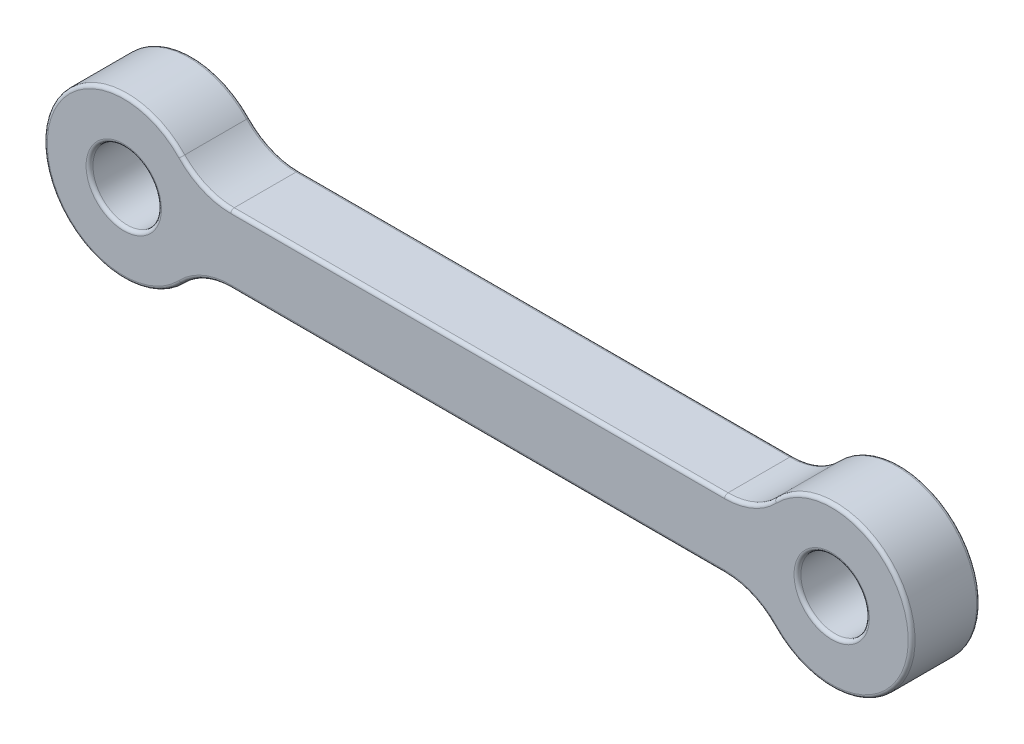
ISO-10303-21;
HEADER;
FILE_DESCRIPTION(('STEP AP214'),'2;1');
FILE_NAME('part.step','',(''),(''),'','','');
FILE_SCHEMA(('AUTOMOTIVE_DESIGN { 1 0 10303 214 1 1 1 1 }'));
ENDSEC;
DATA;
#1=APPLICATION_CONTEXT('core data for automotive mechanical design processes');
#2=APPLICATION_PROTOCOL_DEFINITION('international standard','automotive_design',2000,#1);
#3=PRODUCT_CONTEXT('',#1,'mechanical');
#4=PRODUCT('Part','Part','',(#3));
#5=PRODUCT_RELATED_PRODUCT_CATEGORY('part','',(#4));
#6=PRODUCT_DEFINITION_FORMATION('','',#4);
#7=PRODUCT_DEFINITION_CONTEXT('part definition',#1,'design');
#8=PRODUCT_DEFINITION('design','',#6,#7);
#9=PRODUCT_DEFINITION_SHAPE('','',#8);
#10=(LENGTH_UNIT() NAMED_UNIT(*) SI_UNIT(.MILLI.,.METRE.));
#11=(NAMED_UNIT(*) PLANE_ANGLE_UNIT() SI_UNIT($,.RADIAN.));
#12=(NAMED_UNIT(*) SI_UNIT($,.STERADIAN.) SOLID_ANGLE_UNIT());
#13=UNCERTAINTY_MEASURE_WITH_UNIT(LENGTH_MEASURE(1.E-05),#10,'distance_accuracy_value','');
#14=(GEOMETRIC_REPRESENTATION_CONTEXT(3) GLOBAL_UNCERTAINTY_ASSIGNED_CONTEXT((#13)) GLOBAL_UNIT_ASSIGNED_CONTEXT((#10,
#11,#12)) REPRESENTATION_CONTEXT('',''));
#15=CARTESIAN_POINT('',(0.,0.,0.));
#16=DIRECTION('',(0.,0.,1.));
#17=DIRECTION('',(1.,0.,0.));
#18=AXIS2_PLACEMENT_3D('',#15,#16,#17);
#19=CARTESIAN_POINT('',(31.,0.,1.5));
#20=DIRECTION('',(0.,0.,1.));
#21=DIRECTION('',(1.,0.,0.));
#22=AXIS2_PLACEMENT_3D('',#19,#20,#21);
#23=PLANE('',#22);
#24=CARTESIAN_POINT('',(31.,0.,1.5));
#25=DIRECTION('',(0.,0.,1.));
#26=DIRECTION('',(1.,0.,0.));
#27=AXIS2_PLACEMENT_3D('',#24,#25,#26);
#28=CIRCLE('',#27,1.65);
#29=CARTESIAN_POINT('',(32.65,0.,1.5));
#30=VERTEX_POINT('',#29);
#31=EDGE_CURVE('E177',#30,#30,#28,.F.);
#32=ORIENTED_EDGE('',*,*,#31,.T.);
#33=EDGE_LOOP('',(#32));
#34=FACE_BOUND('',#33,.T.);
#35=CARTESIAN_POINT('',(0.,0.,1.5));
#36=DIRECTION('',(0.,0.,1.));
#37=DIRECTION('',(1.,0.,0.));
#38=AXIS2_PLACEMENT_3D('',#35,#36,#37);
#39=CIRCLE('',#38,3.35);
#40=CARTESIAN_POINT('',(2.41736809296362,2.31923079988203,1.5));
#41=VERTEX_POINT('',#40);
#42=CARTESIAN_POINT('',(2.41736815177746,-2.31923073857951,1.5));
#43=VERTEX_POINT('',#42);
#44=EDGE_CURVE('E175',#41,#43,#39,.T.);
#45=ORIENTED_EDGE('',*,*,#44,.T.);
#46=CARTESIAN_POINT('',(4.69041581688163,-4.4999999405274,1.5));
#47=DIRECTION('',(0.,0.,1.));
#48=DIRECTION('',(1.,0.,0.));
#49=AXIS2_PLACEMENT_3D('',#46,#47,#48);
#50=CIRCLE('',#49,3.15);
#51=CARTESIAN_POINT('',(4.69041581688163,-1.3499999405274,1.5));
#52=VERTEX_POINT('',#51);
#53=EDGE_CURVE('E156',#43,#52,#50,.F.);
#54=ORIENTED_EDGE('',*,*,#53,.T.);
#55=DIRECTION('',(1.,0.,0.));
#56=VECTOR('',#55,1.);
#57=CARTESIAN_POINT('',(26.3095841831184,-1.3499999405274,1.5));
#58=LINE('',#57,#56);
#59=CARTESIAN_POINT('',(26.3095841831184,-1.3499999405274,1.5));
#60=VERTEX_POINT('',#59);
#61=EDGE_CURVE('E164',#52,#60,#58,.T.);
#62=ORIENTED_EDGE('',*,*,#61,.T.);
#63=CARTESIAN_POINT('',(26.3095841831184,-4.4999999405274,1.5));
#64=DIRECTION('',(0.,0.,1.));
#65=DIRECTION('',(1.,0.,0.));
#66=AXIS2_PLACEMENT_3D('',#63,#64,#65);
#67=CIRCLE('',#66,3.15);
#68=CARTESIAN_POINT('',(28.5826318482225,-2.31923073857951,1.5));
#69=VERTEX_POINT('',#68);
#70=EDGE_CURVE('E170',#60,#69,#67,.F.);
#71=ORIENTED_EDGE('',*,*,#70,.T.);
#72=CARTESIAN_POINT('',(31.,0.,1.5));
#73=DIRECTION('',(0.,0.,1.));
#74=DIRECTION('',(1.,0.,0.));
#75=AXIS2_PLACEMENT_3D('',#72,#73,#74);
#76=CIRCLE('',#75,3.35);
#77=CARTESIAN_POINT('',(28.5826319070364,2.31923079988203,1.5));
#78=VERTEX_POINT('',#77);
#79=EDGE_CURVE('E327',#69,#78,#76,.T.);
#80=ORIENTED_EDGE('',*,*,#79,.T.);
#81=CARTESIAN_POINT('',(26.3095842972348,4.5000000594726,1.5));
#82=DIRECTION('',(0.,0.,1.));
#83=DIRECTION('',(1.,0.,0.));
#84=AXIS2_PLACEMENT_3D('',#81,#82,#83);
#85=CIRCLE('',#84,3.15);
#86=CARTESIAN_POINT('',(26.3095842972348,1.3500000594726,1.5));
#87=VERTEX_POINT('',#86);
#88=EDGE_CURVE('E329',#78,#87,#85,.F.);
#89=ORIENTED_EDGE('',*,*,#88,.T.);
#90=DIRECTION('',(-1.,0.,0.));
#91=VECTOR('',#90,1.);
#92=CARTESIAN_POINT('',(4.69041570276522,1.3500000594726,1.5));
#93=LINE('',#92,#91);
#94=CARTESIAN_POINT('',(4.69041570276522,1.3500000594726,1.5));
#95=VERTEX_POINT('',#94);
#96=EDGE_CURVE('E331',#87,#95,#93,.T.);
#97=ORIENTED_EDGE('',*,*,#96,.T.);
#98=CARTESIAN_POINT('',(4.69041570276522,4.5000000594726,1.5));
#99=DIRECTION('',(0.,0.,1.));
#100=DIRECTION('',(1.,0.,0.));
#101=AXIS2_PLACEMENT_3D('',#98,#99,#100);
#102=CIRCLE('',#101,3.15);
#103=EDGE_CURVE('E182',#95,#41,#102,.F.);
#104=ORIENTED_EDGE('',*,*,#103,.T.);
#105=EDGE_LOOP('',(#45,#54,#62,#71,#80,#89,#97,#104));
#106=FACE_BOUND('',#105,.T.);
#107=CARTESIAN_POINT('',(0.,0.,1.5));
#108=DIRECTION('',(0.,0.,1.));
#109=DIRECTION('',(1.,0.,0.));
#110=AXIS2_PLACEMENT_3D('',#107,#108,#109);
#111=CIRCLE('',#110,1.65);
#112=CARTESIAN_POINT('',(1.65,0.,1.5));
#113=VERTEX_POINT('',#112);
#114=EDGE_CURVE('E171',#113,#113,#111,.F.);
#115=ORIENTED_EDGE('',*,*,#114,.T.);
#116=EDGE_LOOP('',(#115));
#117=FACE_BOUND('',#116,.T.);
#118=ADVANCED_FACE('F36',(#34,#106,#117),#23,.T.);
#119=CARTESIAN_POINT('',(31.,0.,-1.5));
#120=DIRECTION('',(0.,0.,1.));
#121=DIRECTION('',(1.,0.,0.));
#122=AXIS2_PLACEMENT_3D('',#119,#120,#121);
#123=PLANE('',#122);
#124=CARTESIAN_POINT('',(31.,0.,-1.5));
#125=DIRECTION('',(0.,0.,1.));
#126=DIRECTION('',(1.,0.,0.));
#127=AXIS2_PLACEMENT_3D('',#124,#125,#126);
#128=CIRCLE('',#127,1.65);
#129=CARTESIAN_POINT('',(32.65,0.,-1.5));
#130=VERTEX_POINT('',#129);
#131=EDGE_CURVE('E11',#130,#130,#128,.T.);
#132=ORIENTED_EDGE('',*,*,#131,.T.);
#133=EDGE_LOOP('',(#132));
#134=FACE_BOUND('',#133,.T.);
#135=CARTESIAN_POINT('',(0.,0.,-1.5));
#136=DIRECTION('',(0.,0.,1.));
#137=DIRECTION('',(1.,0.,0.));
#138=AXIS2_PLACEMENT_3D('',#135,#136,#137);
#139=CIRCLE('',#138,1.65);
#140=CARTESIAN_POINT('',(1.65,0.,-1.5));
#141=VERTEX_POINT('',#140);
#142=EDGE_CURVE('E45',#141,#141,#139,.T.);
#143=ORIENTED_EDGE('',*,*,#142,.T.);
#144=EDGE_LOOP('',(#143));
#145=FACE_BOUND('',#144,.T.);
#146=DIRECTION('',(-1.,0.,0.));
#147=VECTOR('',#146,1.);
#148=CARTESIAN_POINT('',(31.,1.3500000594726,-1.5));
#149=LINE('',#148,#147);
#150=CARTESIAN_POINT('',(4.69041570276522,1.3500000594726,-1.5));
#151=VERTEX_POINT('',#150);
#152=CARTESIAN_POINT('',(26.3095842972348,1.3500000594726,-1.5));
#153=VERTEX_POINT('',#152);
#154=EDGE_CURVE('E53',#151,#153,#149,.F.);
#155=ORIENTED_EDGE('',*,*,#154,.T.);
#156=CARTESIAN_POINT('',(26.3095842972348,4.5000000594726,-1.5));
#157=DIRECTION('',(0.,0.,1.));
#158=DIRECTION('',(1.,0.,0.));
#159=AXIS2_PLACEMENT_3D('',#156,#157,#158);
#160=CIRCLE('',#159,3.15);
#161=CARTESIAN_POINT('',(28.5826319070364,2.31923079988203,-1.5));
#162=VERTEX_POINT('',#161);
#163=EDGE_CURVE('E235',#153,#162,#160,.T.);
#164=ORIENTED_EDGE('',*,*,#163,.T.);
#165=CARTESIAN_POINT('',(31.,0.,-1.5));
#166=DIRECTION('',(0.,0.,1.));
#167=DIRECTION('',(1.,0.,0.));
#168=AXIS2_PLACEMENT_3D('',#165,#166,#167);
#169=CIRCLE('',#168,3.35);
#170=CARTESIAN_POINT('',(28.5826318482225,-2.31923073857951,-1.5));
#171=VERTEX_POINT('',#170);
#172=EDGE_CURVE('E223',#162,#171,#169,.F.);
#173=ORIENTED_EDGE('',*,*,#172,.T.);
#174=CARTESIAN_POINT('',(26.3095841831184,-4.4999999405274,-1.5));
#175=DIRECTION('',(0.,0.,1.));
#176=DIRECTION('',(1.,0.,0.));
#177=AXIS2_PLACEMENT_3D('',#174,#175,#176);
#178=CIRCLE('',#177,3.15);
#179=CARTESIAN_POINT('',(26.3095841831184,-1.3499999405274,-1.5));
#180=VERTEX_POINT('',#179);
#181=EDGE_CURVE('E225',#171,#180,#178,.T.);
#182=ORIENTED_EDGE('',*,*,#181,.T.);
#183=DIRECTION('',(1.,0.,0.));
#184=VECTOR('',#183,1.);
#185=CARTESIAN_POINT('',(31.,-1.3499999405274,-1.5));
#186=LINE('',#185,#184);
#187=CARTESIAN_POINT('',(4.69041581688163,-1.3499999405274,-1.5));
#188=VERTEX_POINT('',#187);
#189=EDGE_CURVE('E227',#180,#188,#186,.F.);
#190=ORIENTED_EDGE('',*,*,#189,.T.);
#191=CARTESIAN_POINT('',(4.69041581688163,-4.4999999405274,-1.5));
#192=DIRECTION('',(0.,0.,1.));
#193=DIRECTION('',(1.,0.,0.));
#194=AXIS2_PLACEMENT_3D('',#191,#192,#193);
#195=CIRCLE('',#194,3.15);
#196=CARTESIAN_POINT('',(2.41736815177746,-2.31923073857951,-1.5));
#197=VERTEX_POINT('',#196);
#198=EDGE_CURVE('E229',#188,#197,#195,.T.);
#199=ORIENTED_EDGE('',*,*,#198,.T.);
#200=CARTESIAN_POINT('',(0.,0.,-1.5));
#201=DIRECTION('',(0.,0.,1.));
#202=DIRECTION('',(1.,0.,0.));
#203=AXIS2_PLACEMENT_3D('',#200,#201,#202);
#204=CIRCLE('',#203,3.35);
#205=CARTESIAN_POINT('',(2.41736809296362,2.31923079988203,-1.5));
#206=VERTEX_POINT('',#205);
#207=EDGE_CURVE('E231',#197,#206,#204,.F.);
#208=ORIENTED_EDGE('',*,*,#207,.T.);
#209=CARTESIAN_POINT('',(4.69041570276522,4.5000000594726,-1.5));
#210=DIRECTION('',(0.,0.,1.));
#211=DIRECTION('',(1.,0.,0.));
#212=AXIS2_PLACEMENT_3D('',#209,#210,#211);
#213=CIRCLE('',#212,3.15);
#214=EDGE_CURVE('E58',#206,#151,#213,.T.);
#215=ORIENTED_EDGE('',*,*,#214,.T.);
#216=EDGE_LOOP('',(#155,#164,#173,#182,#190,#199,#208,#215));
#217=FACE_BOUND('',#216,.T.);
#218=ADVANCED_FACE('F360',(#134,#145,#217),#123,.F.);
#219=CARTESIAN_POINT('',(31.,0.,1.5));
#220=DIRECTION('',(0.,0.,-1.));
#221=DIRECTION('',(-1.,0.,0.));
#222=AXIS2_PLACEMENT_3D('',#219,#220,#221);
#223=CYLINDRICAL_SURFACE('',#222,3.5);
#224=DIRECTION('',(0.,0.,-1.));
#225=VECTOR('',#224,1.);
#226=CARTESIAN_POINT('',(28.4743915446649,2.42307695510063,1.5));
#227=LINE('',#226,#225);
#228=CARTESIAN_POINT('',(28.4743915446649,2.42307695510063,-1.35));
#229=VERTEX_POINT('',#228);
#230=CARTESIAN_POINT('',(28.4743915446649,2.42307695510063,1.35));
#231=VERTEX_POINT('',#230);
#232=EDGE_CURVE('E256',#229,#231,#227,.F.);
#233=ORIENTED_EDGE('',*,*,#232,.T.);
#234=CARTESIAN_POINT('',(31.,0.,1.35));
#235=DIRECTION('',(0.,0.,1.));
#236=DIRECTION('',(1.,0.,0.));
#237=AXIS2_PLACEMENT_3D('',#234,#235,#236);
#238=CIRCLE('',#237,3.5);
#239=CARTESIAN_POINT('',(28.4743914832176,-2.42307689105321,1.35));
#240=VERTEX_POINT('',#239);
#241=EDGE_CURVE('E207',#231,#240,#238,.F.);
#242=ORIENTED_EDGE('',*,*,#241,.T.);
#243=DIRECTION('',(0.,0.,-1.));
#244=VECTOR('',#243,1.);
#245=CARTESIAN_POINT('',(28.4743914832176,-2.42307689105321,1.5));
#246=LINE('',#245,#244);
#247=CARTESIAN_POINT('',(28.4743914832176,-2.42307689105321,-1.35));
#248=VERTEX_POINT('',#247);
#249=EDGE_CURVE('E301',#240,#248,#246,.T.);
#250=ORIENTED_EDGE('',*,*,#249,.T.);
#251=CARTESIAN_POINT('',(31.,0.,-1.35));
#252=DIRECTION('',(0.,0.,1.));
#253=DIRECTION('',(1.,0.,0.));
#254=AXIS2_PLACEMENT_3D('',#251,#252,#253);
#255=CIRCLE('',#254,3.5);
#256=EDGE_CURVE('E205',#248,#229,#255,.T.);
#257=ORIENTED_EDGE('',*,*,#256,.T.);
#258=EDGE_LOOP('',(#233,#242,#250,#257));
#259=FACE_BOUND('',#258,.T.);
#260=ADVANCED_FACE('F373',(#259),#223,.T.);
#261=CARTESIAN_POINT('',(27.837722368042,1.5000000594726,1.5));
#262=DIRECTION('',(0.,-1.,0.));
#263=DIRECTION('',(1.,0.,0.));
#264=AXIS2_PLACEMENT_3D('',#261,#262,#263);
#265=PLANE('',#264);
#266=DIRECTION('',(0.,0.,1.));
#267=VECTOR('',#266,1.);
#268=CARTESIAN_POINT('',(4.69041570276522,1.5000000594726,1.5));
#269=LINE('',#268,#267);
#270=CARTESIAN_POINT('',(4.69041570276522,1.5000000594726,-1.35));
#271=VERTEX_POINT('',#270);
#272=CARTESIAN_POINT('',(4.69041570276522,1.5000000594726,1.35));
#273=VERTEX_POINT('',#272);
#274=EDGE_CURVE('E303',#271,#273,#269,.T.);
#275=ORIENTED_EDGE('',*,*,#274,.T.);
#276=DIRECTION('',(-1.,0.,0.));
#277=VECTOR('',#276,1.);
#278=CARTESIAN_POINT('',(26.3095842972348,1.5000000594726,1.35));
#279=LINE('',#278,#277);
#280=CARTESIAN_POINT('',(26.3095842972348,1.5000000594726,1.35));
#281=VERTEX_POINT('',#280);
#282=EDGE_CURVE('E198',#273,#281,#279,.F.);
#283=ORIENTED_EDGE('',*,*,#282,.T.);
#284=DIRECTION('',(0.,0.,1.));
#285=VECTOR('',#284,1.);
#286=CARTESIAN_POINT('',(26.3095842972348,1.5000000594726,-1.5));
#287=LINE('',#286,#285);
#288=CARTESIAN_POINT('',(26.3095842972348,1.5000000594726,-1.35));
#289=VERTEX_POINT('',#288);
#290=EDGE_CURVE('E311',#281,#289,#287,.F.);
#291=ORIENTED_EDGE('',*,*,#290,.T.);
#292=DIRECTION('',(-1.,0.,0.));
#293=VECTOR('',#292,1.);
#294=CARTESIAN_POINT('',(27.837722368042,1.5000000594726,-1.35));
#295=LINE('',#294,#293);
#296=EDGE_CURVE('E196',#289,#271,#295,.T.);
#297=ORIENTED_EDGE('',*,*,#296,.T.);
#298=EDGE_LOOP('',(#275,#283,#291,#297));
#299=FACE_BOUND('',#298,.T.);
#300=ADVANCED_FACE('F389',(#299),#265,.F.);
#301=CARTESIAN_POINT('',(0.,0.,1.5));
#302=DIRECTION('',(0.,0.,-1.));
#303=DIRECTION('',(-1.,0.,0.));
#304=AXIS2_PLACEMENT_3D('',#301,#302,#303);
#305=CYLINDRICAL_SURFACE('',#304,3.5);
#306=DIRECTION('',(0.,0.,-1.));
#307=VECTOR('',#306,1.);
#308=CARTESIAN_POINT('',(2.52560851678242,-2.42307689105321,1.5));
#309=LINE('',#308,#307);
#310=CARTESIAN_POINT('',(2.52560851678242,-2.42307689105321,-1.35));
#311=VERTEX_POINT('',#310);
#312=CARTESIAN_POINT('',(2.52560851678242,-2.42307689105321,1.35));
#313=VERTEX_POINT('',#312);
#314=EDGE_CURVE('E295',#311,#313,#309,.F.);
#315=ORIENTED_EDGE('',*,*,#314,.T.);
#316=CARTESIAN_POINT('',(0.,0.,1.35));
#317=DIRECTION('',(0.,0.,1.));
#318=DIRECTION('',(1.,0.,0.));
#319=AXIS2_PLACEMENT_3D('',#316,#317,#318);
#320=CIRCLE('',#319,3.5);
#321=CARTESIAN_POINT('',(2.52560845533512,2.42307695510063,1.35));
#322=VERTEX_POINT('',#321);
#323=EDGE_CURVE('E190',#313,#322,#320,.F.);
#324=ORIENTED_EDGE('',*,*,#323,.T.);
#325=DIRECTION('',(0.,0.,-1.));
#326=VECTOR('',#325,1.);
#327=CARTESIAN_POINT('',(2.52560845533512,2.42307695510063,1.5));
#328=LINE('',#327,#326);
#329=CARTESIAN_POINT('',(2.52560845533512,2.42307695510063,-1.35));
#330=VERTEX_POINT('',#329);
#331=EDGE_CURVE('E314',#322,#330,#328,.T.);
#332=ORIENTED_EDGE('',*,*,#331,.T.);
#333=CARTESIAN_POINT('',(0.,0.,-1.35));
#334=DIRECTION('',(0.,0.,1.));
#335=DIRECTION('',(1.,0.,0.));
#336=AXIS2_PLACEMENT_3D('',#333,#334,#335);
#337=CIRCLE('',#336,3.5);
#338=EDGE_CURVE('E188',#330,#311,#337,.T.);
#339=ORIENTED_EDGE('',*,*,#338,.T.);
#340=EDGE_LOOP('',(#315,#324,#332,#339));
#341=FACE_BOUND('',#340,.T.);
#342=ADVANCED_FACE('F344',(#341),#305,.T.);
#343=CARTESIAN_POINT('',(27.8377223116213,-1.4999999405274,1.5));
#344=DIRECTION('',(0.,1.,0.));
#345=DIRECTION('',(-1.,0.,0.));
#346=AXIS2_PLACEMENT_3D('',#343,#344,#345);
#347=PLANE('',#346);
#348=DIRECTION('',(0.,0.,1.));
#349=VECTOR('',#348,1.);
#350=CARTESIAN_POINT('',(26.3095841831184,-1.4999999405274,1.5));
#351=LINE('',#350,#349);
#352=CARTESIAN_POINT('',(26.3095841831184,-1.4999999405274,-1.35));
#353=VERTEX_POINT('',#352);
#354=CARTESIAN_POINT('',(26.3095841831184,-1.4999999405274,1.35));
#355=VERTEX_POINT('',#354);
#356=EDGE_CURVE('E300',#353,#355,#351,.T.);
#357=ORIENTED_EDGE('',*,*,#356,.T.);
#358=DIRECTION('',(1.,0.,0.));
#359=VECTOR('',#358,1.);
#360=CARTESIAN_POINT('',(4.69041581688164,-1.4999999405274,1.35));
#361=LINE('',#360,#359);
#362=CARTESIAN_POINT('',(4.69041581688163,-1.4999999405274,1.35));
#363=VERTEX_POINT('',#362);
#364=EDGE_CURVE('E215',#355,#363,#361,.F.);
#365=ORIENTED_EDGE('',*,*,#364,.T.);
#366=DIRECTION('',(0.,0.,1.));
#367=VECTOR('',#366,1.);
#368=CARTESIAN_POINT('',(4.69041581688163,-1.4999999405274,-1.5));
#369=LINE('',#368,#367);
#370=CARTESIAN_POINT('',(4.69041581688163,-1.4999999405274,-1.35));
#371=VERTEX_POINT('',#370);
#372=EDGE_CURVE('E293',#363,#371,#369,.F.);
#373=ORIENTED_EDGE('',*,*,#372,.T.);
#374=DIRECTION('',(1.,0.,0.));
#375=VECTOR('',#374,1.);
#376=CARTESIAN_POINT('',(27.8377223116213,-1.4999999405274,-1.35));
#377=LINE('',#376,#375);
#378=EDGE_CURVE('E213',#371,#353,#377,.T.);
#379=ORIENTED_EDGE('',*,*,#378,.T.);
#380=EDGE_LOOP('',(#357,#365,#373,#379));
#381=FACE_BOUND('',#380,.T.);
#382=ADVANCED_FACE('F298',(#381),#347,.F.);
#383=CARTESIAN_POINT('',(0.,0.,1.5));
#384=DIRECTION('',(0.,0.,-1.));
#385=DIRECTION('',(-1.,0.,0.));
#386=AXIS2_PLACEMENT_3D('',#383,#384,#385);
#387=CYLINDRICAL_SURFACE('',#386,1.5);
#388=CARTESIAN_POINT('',(0.,0.,1.35));
#389=DIRECTION('',(0.,0.,1.));
#390=DIRECTION('',(1.,0.,0.));
#391=AXIS2_PLACEMENT_3D('',#388,#389,#390);
#392=CIRCLE('',#391,1.5);
#393=CARTESIAN_POINT('',(1.5,0.,1.35));
#394=VERTEX_POINT('',#393);
#395=EDGE_CURVE('E220',#394,#394,#392,.T.);
#396=ORIENTED_EDGE('',*,*,#395,.T.);
#397=EDGE_LOOP('',(#396));
#398=FACE_BOUND('',#397,.T.);
#399=CARTESIAN_POINT('',(0.,0.,-1.35));
#400=DIRECTION('',(0.,0.,1.));
#401=DIRECTION('',(1.,0.,0.));
#402=AXIS2_PLACEMENT_3D('',#399,#400,#401);
#403=CIRCLE('',#402,1.5);
#404=CARTESIAN_POINT('',(1.5,0.,-1.35));
#405=VERTEX_POINT('',#404);
#406=EDGE_CURVE('E217',#405,#405,#403,.F.);
#407=ORIENTED_EDGE('',*,*,#406,.T.);
#408=EDGE_LOOP('',(#407));
#409=FACE_BOUND('',#408,.T.);
#410=ADVANCED_FACE('F407',(#398,#409),#387,.F.);
#411=CARTESIAN_POINT('',(31.,0.,1.5));
#412=DIRECTION('',(0.,0.,-1.));
#413=DIRECTION('',(-1.,0.,0.));
#414=AXIS2_PLACEMENT_3D('',#411,#412,#413);
#415=CYLINDRICAL_SURFACE('',#414,1.5);
#416=CARTESIAN_POINT('',(31.,0.,1.35));
#417=DIRECTION('',(0.,0.,1.));
#418=DIRECTION('',(1.,0.,0.));
#419=AXIS2_PLACEMENT_3D('',#416,#417,#418);
#420=CIRCLE('',#419,1.5);
#421=CARTESIAN_POINT('',(32.5,0.,1.35));
#422=VERTEX_POINT('',#421);
#423=EDGE_CURVE('E321',#422,#422,#420,.T.);
#424=ORIENTED_EDGE('',*,*,#423,.T.);
#425=EDGE_LOOP('',(#424));
#426=FACE_BOUND('',#425,.T.);
#427=CARTESIAN_POINT('',(31.,0.,-1.35));
#428=DIRECTION('',(0.,0.,1.));
#429=DIRECTION('',(1.,0.,0.));
#430=AXIS2_PLACEMENT_3D('',#427,#428,#429);
#431=CIRCLE('',#430,1.5);
#432=CARTESIAN_POINT('',(32.5,0.,-1.35));
#433=VERTEX_POINT('',#432);
#434=EDGE_CURVE('E318',#433,#433,#431,.F.);
#435=ORIENTED_EDGE('',*,*,#434,.T.);
#436=EDGE_LOOP('',(#435));
#437=FACE_BOUND('',#436,.T.);
#438=ADVANCED_FACE('F414',(#426,#437),#415,.F.);
#439=CARTESIAN_POINT('',(26.3095841831184,-4.4999999405274,1.5));
#440=DIRECTION('',(0.,0.,-1.));
#441=DIRECTION('',(-1.,0.,0.));
#442=AXIS2_PLACEMENT_3D('',#439,#440,#441);
#443=CYLINDRICAL_SURFACE('',#442,3.);
#444=ORIENTED_EDGE('',*,*,#249,.F.);
#445=CARTESIAN_POINT('',(26.3095841831184,-4.4999999405274,1.35));
#446=DIRECTION('',(0.,0.,1.));
#447=DIRECTION('',(1.,0.,0.));
#448=AXIS2_PLACEMENT_3D('',#445,#446,#447);
#449=CIRCLE('',#448,3.);
#450=EDGE_CURVE('E211',#240,#355,#449,.T.);
#451=ORIENTED_EDGE('',*,*,#450,.T.);
#452=ORIENTED_EDGE('',*,*,#356,.F.);
#453=CARTESIAN_POINT('',(26.3095841831184,-4.4999999405274,-1.35));
#454=DIRECTION('',(0.,0.,1.));
#455=DIRECTION('',(1.,0.,0.));
#456=AXIS2_PLACEMENT_3D('',#453,#454,#455);
#457=CIRCLE('',#456,3.);
#458=EDGE_CURVE('E209',#353,#248,#457,.F.);
#459=ORIENTED_EDGE('',*,*,#458,.T.);
#460=EDGE_LOOP('',(#444,#451,#452,#459));
#461=FACE_BOUND('',#460,.T.);
#462=ADVANCED_FACE('F419',(#461),#443,.F.);
#463=CARTESIAN_POINT('',(26.3095842972348,4.5000000594726,1.5));
#464=DIRECTION('',(0.,0.,-1.));
#465=DIRECTION('',(-1.,0.,0.));
#466=AXIS2_PLACEMENT_3D('',#463,#464,#465);
#467=CYLINDRICAL_SURFACE('',#466,3.);
#468=ORIENTED_EDGE('',*,*,#290,.F.);
#469=CARTESIAN_POINT('',(26.3095842972348,4.5000000594726,1.35));
#470=DIRECTION('',(0.,0.,1.));
#471=DIRECTION('',(1.,0.,0.));
#472=AXIS2_PLACEMENT_3D('',#469,#470,#471);
#473=CIRCLE('',#472,3.);
#474=EDGE_CURVE('E203',#281,#231,#473,.T.);
#475=ORIENTED_EDGE('',*,*,#474,.T.);
#476=ORIENTED_EDGE('',*,*,#232,.F.);
#477=CARTESIAN_POINT('',(26.3095842972348,4.5000000594726,-1.35));
#478=DIRECTION('',(0.,0.,1.));
#479=DIRECTION('',(1.,0.,0.));
#480=AXIS2_PLACEMENT_3D('',#477,#478,#479);
#481=CIRCLE('',#480,3.);
#482=EDGE_CURVE('E200',#229,#289,#481,.F.);
#483=ORIENTED_EDGE('',*,*,#482,.T.);
#484=EDGE_LOOP('',(#468,#475,#476,#483));
#485=FACE_BOUND('',#484,.T.);
#486=ADVANCED_FACE('F378',(#485),#467,.F.);
#487=CARTESIAN_POINT('',(4.69041581688163,-4.4999999405274,1.5));
#488=DIRECTION('',(0.,0.,-1.));
#489=DIRECTION('',(-1.,0.,0.));
#490=AXIS2_PLACEMENT_3D('',#487,#488,#489);
#491=CYLINDRICAL_SURFACE('',#490,3.);
#492=ORIENTED_EDGE('',*,*,#372,.F.);
#493=CARTESIAN_POINT('',(4.69041581688163,-4.4999999405274,1.35));
#494=DIRECTION('',(0.,0.,1.));
#495=DIRECTION('',(1.,0.,0.));
#496=AXIS2_PLACEMENT_3D('',#493,#494,#495);
#497=CIRCLE('',#496,3.);
#498=EDGE_CURVE('E158',#363,#313,#497,.T.);
#499=ORIENTED_EDGE('',*,*,#498,.T.);
#500=ORIENTED_EDGE('',*,*,#314,.F.);
#501=CARTESIAN_POINT('',(4.69041581688163,-4.4999999405274,-1.35));
#502=DIRECTION('',(0.,0.,1.));
#503=DIRECTION('',(1.,0.,0.));
#504=AXIS2_PLACEMENT_3D('',#501,#502,#503);
#505=CIRCLE('',#504,3.);
#506=EDGE_CURVE('E180',#311,#371,#505,.F.);
#507=ORIENTED_EDGE('',*,*,#506,.T.);
#508=EDGE_LOOP('',(#492,#499,#500,#507));
#509=FACE_BOUND('',#508,.T.);
#510=ADVANCED_FACE('F292',(#509),#491,.F.);
#511=CARTESIAN_POINT('',(4.69041570276522,4.5000000594726,1.5));
#512=DIRECTION('',(0.,0.,-1.));
#513=DIRECTION('',(-1.,0.,0.));
#514=AXIS2_PLACEMENT_3D('',#511,#512,#513);
#515=CYLINDRICAL_SURFACE('',#514,3.);
#516=ORIENTED_EDGE('',*,*,#331,.F.);
#517=CARTESIAN_POINT('',(4.69041570276522,4.5000000594726,1.35));
#518=DIRECTION('',(0.,0.,1.));
#519=DIRECTION('',(1.,0.,0.));
#520=AXIS2_PLACEMENT_3D('',#517,#518,#519);
#521=CIRCLE('',#520,3.);
#522=EDGE_CURVE('E194',#322,#273,#521,.T.);
#523=ORIENTED_EDGE('',*,*,#522,.T.);
#524=ORIENTED_EDGE('',*,*,#274,.F.);
#525=CARTESIAN_POINT('',(4.69041570276522,4.5000000594726,-1.35));
#526=DIRECTION('',(0.,0.,1.));
#527=DIRECTION('',(1.,0.,0.));
#528=AXIS2_PLACEMENT_3D('',#525,#526,#527);
#529=CIRCLE('',#528,3.);
#530=EDGE_CURVE('E192',#271,#330,#529,.F.);
#531=ORIENTED_EDGE('',*,*,#530,.T.);
#532=EDGE_LOOP('',(#516,#523,#524,#531));
#533=FACE_BOUND('',#532,.T.);
#534=ADVANCED_FACE('F346',(#533),#515,.F.);
#535=CARTESIAN_POINT('',(31.,0.,1.35));
#536=DIRECTION('',(0.,0.,1.));
#537=DIRECTION('',(1.,0.,0.));
#538=AXIS2_PLACEMENT_3D('',#535,#536,#537);
#539=TOROIDAL_SURFACE('',#538,1.65,0.15);
#540=ORIENTED_EDGE('',*,*,#31,.F.);
#541=EDGE_LOOP('',(#540));
#542=FACE_BOUND('',#541,.T.);
#543=ORIENTED_EDGE('',*,*,#423,.F.);
#544=EDGE_LOOP('',(#543));
#545=FACE_BOUND('',#544,.T.);
#546=ADVANCED_FACE('F577',(#542,#545),#539,.T.);
#547=CARTESIAN_POINT('',(26.3095842972348,4.5000000594726,1.35));
#548=DIRECTION('',(0.,0.,1.));
#549=DIRECTION('',(1.,0.,0.));
#550=AXIS2_PLACEMENT_3D('',#547,#548,#549);
#551=TOROIDAL_SURFACE('',#550,3.15,0.15);
#552=CARTESIAN_POINT('',(28.5826319070364,2.31923079988203,1.35));
#553=DIRECTION('',(0.692307701457319,0.721602415810039,0.));
#554=DIRECTION('',(-0.721602415810039,0.692307701457319,0.));
#555=AXIS2_PLACEMENT_3D('',#552,#553,#554);
#556=CIRCLE('',#555,0.15);
#557=EDGE_CURVE('E250',#231,#78,#556,.T.);
#558=ORIENTED_EDGE('',*,*,#557,.F.);
#559=ORIENTED_EDGE('',*,*,#474,.F.);
#560=CARTESIAN_POINT('',(26.3095842972348,1.3500000594726,1.35));
#561=DIRECTION('',(-1.,0.,0.));
#562=DIRECTION('',(0.,0.,1.));
#563=AXIS2_PLACEMENT_3D('',#560,#561,#562);
#564=CIRCLE('',#563,0.15);
#565=EDGE_CURVE('E253',#87,#281,#564,.T.);
#566=ORIENTED_EDGE('',*,*,#565,.F.);
#567=ORIENTED_EDGE('',*,*,#88,.F.);
#568=EDGE_LOOP('',(#558,#559,#566,#567));
#569=FACE_BOUND('',#568,.T.);
#570=ADVANCED_FACE('F382',(#569),#551,.T.);
#571=CARTESIAN_POINT('',(31.,1.3500000594726,1.35));
#572=DIRECTION('',(1.,0.,0.));
#573=DIRECTION('',(0.,1.,0.));
#574=AXIS2_PLACEMENT_3D('',#571,#572,#573);
#575=CYLINDRICAL_SURFACE('',#574,0.15);
#576=ORIENTED_EDGE('',*,*,#565,.T.);
#577=ORIENTED_EDGE('',*,*,#282,.F.);
#578=CARTESIAN_POINT('',(4.69041570276522,1.3500000594726,1.35));
#579=DIRECTION('',(-1.,0.,0.));
#580=DIRECTION('',(0.,0.,1.));
#581=AXIS2_PLACEMENT_3D('',#578,#579,#580);
#582=CIRCLE('',#581,0.15);
#583=EDGE_CURVE('E247',#95,#273,#582,.T.);
#584=ORIENTED_EDGE('',*,*,#583,.F.);
#585=ORIENTED_EDGE('',*,*,#96,.F.);
#586=EDGE_LOOP('',(#576,#577,#584,#585));
#587=FACE_BOUND('',#586,.T.);
#588=ADVANCED_FACE('F387',(#587),#575,.T.);
#589=CARTESIAN_POINT('',(31.,0.,1.35));
#590=DIRECTION('',(0.,0.,1.));
#591=DIRECTION('',(1.,0.,0.));
#592=AXIS2_PLACEMENT_3D('',#589,#590,#591);
#593=TOROIDAL_SURFACE('',#592,3.35,0.15);
#594=ORIENTED_EDGE('',*,*,#557,.T.);
#595=ORIENTED_EDGE('',*,*,#79,.F.);
#596=CARTESIAN_POINT('',(28.5826318482225,-2.31923073857951,1.35));
#597=DIRECTION('',(-0.692307683158065,0.721602433366402,0.));
#598=DIRECTION('',(-0.721602433366402,-0.692307683158065,0.));
#599=AXIS2_PLACEMENT_3D('',#596,#597,#598);
#600=CIRCLE('',#599,0.15);
#601=EDGE_CURVE('E244',#240,#69,#600,.T.);
#602=ORIENTED_EDGE('',*,*,#601,.F.);
#603=ORIENTED_EDGE('',*,*,#241,.F.);
#604=EDGE_LOOP('',(#594,#595,#602,#603));
#605=FACE_BOUND('',#604,.T.);
#606=ADVANCED_FACE('F554',(#605),#593,.T.);
#607=CARTESIAN_POINT('',(4.69041570276522,4.5000000594726,1.35));
#608=DIRECTION('',(0.,0.,1.));
#609=DIRECTION('',(1.,0.,0.));
#610=AXIS2_PLACEMENT_3D('',#607,#608,#609);
#611=TOROIDAL_SURFACE('',#610,3.15,0.15);
#612=ORIENTED_EDGE('',*,*,#583,.T.);
#613=ORIENTED_EDGE('',*,*,#522,.F.);
#614=CARTESIAN_POINT('',(2.41736809296362,2.31923079988203,1.35));
#615=DIRECTION('',(-0.692307701457323,0.721602415810035,0.));
#616=DIRECTION('',(-0.721602415810035,-0.692307701457323,0.));
#617=AXIS2_PLACEMENT_3D('',#614,#615,#616);
#618=CIRCLE('',#617,0.15);
#619=EDGE_CURVE('E241',#41,#322,#618,.T.);
#620=ORIENTED_EDGE('',*,*,#619,.F.);
#621=ORIENTED_EDGE('',*,*,#103,.F.);
#622=EDGE_LOOP('',(#612,#613,#620,#621));
#623=FACE_BOUND('',#622,.T.);
#624=ADVANCED_FACE('F338',(#623),#611,.T.);
#625=CARTESIAN_POINT('',(26.3095841831184,-4.4999999405274,1.35));
#626=DIRECTION('',(0.,0.,1.));
#627=DIRECTION('',(1.,0.,0.));
#628=AXIS2_PLACEMENT_3D('',#625,#626,#627);
#629=TOROIDAL_SURFACE('',#628,3.15,0.15);
#630=ORIENTED_EDGE('',*,*,#601,.T.);
#631=ORIENTED_EDGE('',*,*,#70,.F.);
#632=CARTESIAN_POINT('',(26.3095841831184,-1.3499999405274,1.35));
#633=DIRECTION('',(-1.,0.,0.));
#634=DIRECTION('',(0.,0.,1.));
#635=AXIS2_PLACEMENT_3D('',#632,#633,#634);
#636=CIRCLE('',#635,0.15);
#637=EDGE_CURVE('E167',#355,#60,#636,.T.);
#638=ORIENTED_EDGE('',*,*,#637,.F.);
#639=ORIENTED_EDGE('',*,*,#450,.F.);
#640=EDGE_LOOP('',(#630,#631,#638,#639));
#641=FACE_BOUND('',#640,.T.);
#642=ADVANCED_FACE('F538',(#641),#629,.T.);
#643=CARTESIAN_POINT('',(0.,0.,1.35));
#644=DIRECTION('',(0.,0.,1.));
#645=DIRECTION('',(1.,0.,0.));
#646=AXIS2_PLACEMENT_3D('',#643,#644,#645);
#647=TOROIDAL_SURFACE('',#646,3.35,0.15);
#648=ORIENTED_EDGE('',*,*,#619,.T.);
#649=ORIENTED_EDGE('',*,*,#323,.F.);
#650=CARTESIAN_POINT('',(2.41736815177746,-2.31923073857951,1.35));
#651=DIRECTION('',(0.692307683158062,0.721602433366404,0.));
#652=DIRECTION('',(-0.721602433366404,0.692307683158062,0.));
#653=AXIS2_PLACEMENT_3D('',#650,#651,#652);
#654=CIRCLE('',#653,0.15);
#655=EDGE_CURVE('E161',#43,#313,#654,.T.);
#656=ORIENTED_EDGE('',*,*,#655,.F.);
#657=ORIENTED_EDGE('',*,*,#44,.F.);
#658=EDGE_LOOP('',(#648,#649,#656,#657));
#659=FACE_BOUND('',#658,.T.);
#660=ADVANCED_FACE('F341',(#659),#647,.T.);
#661=CARTESIAN_POINT('',(31.,-1.3499999405274,1.35));
#662=DIRECTION('',(-1.,0.,0.));
#663=DIRECTION('',(0.,-1.,0.));
#664=AXIS2_PLACEMENT_3D('',#661,#662,#663);
#665=CYLINDRICAL_SURFACE('',#664,0.15);
#666=ORIENTED_EDGE('',*,*,#637,.T.);
#667=ORIENTED_EDGE('',*,*,#61,.F.);
#668=CARTESIAN_POINT('',(4.69041581688163,-1.3499999405274,1.35));
#669=DIRECTION('',(-1.,0.,0.));
#670=DIRECTION('',(0.,0.,1.));
#671=AXIS2_PLACEMENT_3D('',#668,#669,#670);
#672=CIRCLE('',#671,0.15);
#673=EDGE_CURVE('E152',#363,#52,#672,.T.);
#674=ORIENTED_EDGE('',*,*,#673,.F.);
#675=ORIENTED_EDGE('',*,*,#364,.F.);
#676=EDGE_LOOP('',(#666,#667,#674,#675));
#677=FACE_BOUND('',#676,.T.);
#678=ADVANCED_FACE('F165',(#677),#665,.T.);
#679=CARTESIAN_POINT('',(4.69041581688163,-4.4999999405274,1.35));
#680=DIRECTION('',(0.,0.,1.));
#681=DIRECTION('',(1.,0.,0.));
#682=AXIS2_PLACEMENT_3D('',#679,#680,#681);
#683=TOROIDAL_SURFACE('',#682,3.15,0.15);
#684=ORIENTED_EDGE('',*,*,#655,.T.);
#685=ORIENTED_EDGE('',*,*,#498,.F.);
#686=ORIENTED_EDGE('',*,*,#673,.T.);
#687=ORIENTED_EDGE('',*,*,#53,.F.);
#688=EDGE_LOOP('',(#684,#685,#686,#687));
#689=FACE_BOUND('',#688,.T.);
#690=ADVANCED_FACE('F154',(#689),#683,.T.);
#691=CARTESIAN_POINT('',(0.,0.,1.35));
#692=DIRECTION('',(0.,0.,1.));
#693=DIRECTION('',(1.,0.,0.));
#694=AXIS2_PLACEMENT_3D('',#691,#692,#693);
#695=TOROIDAL_SURFACE('',#694,1.65,0.15);
#696=ORIENTED_EDGE('',*,*,#114,.F.);
#697=EDGE_LOOP('',(#696));
#698=FACE_BOUND('',#697,.T.);
#699=ORIENTED_EDGE('',*,*,#395,.F.);
#700=EDGE_LOOP('',(#699));
#701=FACE_BOUND('',#700,.T.);
#702=ADVANCED_FACE('F436',(#698,#701),#695,.T.);
#703=CARTESIAN_POINT('',(31.,0.,-1.35));
#704=DIRECTION('',(0.,0.,1.));
#705=DIRECTION('',(1.,0.,0.));
#706=AXIS2_PLACEMENT_3D('',#703,#704,#705);
#707=TOROIDAL_SURFACE('',#706,1.65,0.15);
#708=ORIENTED_EDGE('',*,*,#434,.F.);
#709=EDGE_LOOP('',(#708));
#710=FACE_BOUND('',#709,.T.);
#711=ORIENTED_EDGE('',*,*,#131,.F.);
#712=EDGE_LOOP('',(#711));
#713=FACE_BOUND('',#712,.T.);
#714=ADVANCED_FACE('F428',(#710,#713),#707,.T.);
#715=CARTESIAN_POINT('',(0.,0.,-1.35));
#716=DIRECTION('',(0.,0.,1.));
#717=DIRECTION('',(1.,0.,0.));
#718=AXIS2_PLACEMENT_3D('',#715,#716,#717);
#719=TOROIDAL_SURFACE('',#718,1.65,0.15);
#720=ORIENTED_EDGE('',*,*,#406,.F.);
#721=EDGE_LOOP('',(#720));
#722=FACE_BOUND('',#721,.T.);
#723=ORIENTED_EDGE('',*,*,#142,.F.);
#724=EDGE_LOOP('',(#723));
#725=FACE_BOUND('',#724,.T.);
#726=ADVANCED_FACE('F425',(#722,#725),#719,.T.);
#727=CARTESIAN_POINT('',(4.69041581688163,-4.4999999405274,-1.35));
#728=DIRECTION('',(0.,0.,1.));
#729=DIRECTION('',(1.,0.,0.));
#730=AXIS2_PLACEMENT_3D('',#727,#728,#729);
#731=TOROIDAL_SURFACE('',#730,3.15,0.15);
#732=CARTESIAN_POINT('',(4.69041581688163,-1.3499999405274,-1.35));
#733=DIRECTION('',(1.,0.,0.));
#734=DIRECTION('',(0.,0.,-1.));
#735=AXIS2_PLACEMENT_3D('',#732,#733,#734);
#736=CIRCLE('',#735,0.15);
#737=EDGE_CURVE('E272',#371,#188,#736,.T.);
#738=ORIENTED_EDGE('',*,*,#737,.F.);
#739=ORIENTED_EDGE('',*,*,#506,.F.);
#740=CARTESIAN_POINT('',(2.41736815177746,-2.31923073857951,-1.35));
#741=DIRECTION('',(-0.692307683158062,-0.721602433366404,0.));
#742=DIRECTION('',(0.721602433366404,-0.692307683158062,0.));
#743=AXIS2_PLACEMENT_3D('',#740,#741,#742);
#744=CIRCLE('',#743,0.15);
#745=EDGE_CURVE('E40',#197,#311,#744,.T.);
#746=ORIENTED_EDGE('',*,*,#745,.F.);
#747=ORIENTED_EDGE('',*,*,#198,.F.);
#748=EDGE_LOOP('',(#738,#739,#746,#747));
#749=FACE_BOUND('',#748,.T.);
#750=ADVANCED_FACE('F38',(#749),#731,.T.);
#751=CARTESIAN_POINT('',(0.,0.,-1.35));
#752=DIRECTION('',(0.,0.,1.));
#753=DIRECTION('',(1.,0.,0.));
#754=AXIS2_PLACEMENT_3D('',#751,#752,#753);
#755=TOROIDAL_SURFACE('',#754,3.35,0.15);
#756=ORIENTED_EDGE('',*,*,#745,.T.);
#757=ORIENTED_EDGE('',*,*,#338,.F.);
#758=CARTESIAN_POINT('',(2.41736809296362,2.31923079988203,-1.35));
#759=DIRECTION('',(0.692307701457323,-0.721602415810035,0.));
#760=DIRECTION('',(0.721602415810035,0.692307701457323,0.));
#761=AXIS2_PLACEMENT_3D('',#758,#759,#760);
#762=CIRCLE('',#761,0.15);
#763=EDGE_CURVE('E270',#206,#330,#762,.T.);
#764=ORIENTED_EDGE('',*,*,#763,.F.);
#765=ORIENTED_EDGE('',*,*,#207,.F.);
#766=EDGE_LOOP('',(#756,#757,#764,#765));
#767=FACE_BOUND('',#766,.T.);
#768=ADVANCED_FACE('F283',(#767),#755,.T.);
#769=CARTESIAN_POINT('',(27.8377223116213,-1.3499999405274,-1.35));
#770=DIRECTION('',(1.,0.,0.));
#771=DIRECTION('',(0.,1.,0.));
#772=AXIS2_PLACEMENT_3D('',#769,#770,#771);
#773=CYLINDRICAL_SURFACE('',#772,0.15);
#774=ORIENTED_EDGE('',*,*,#737,.T.);
#775=ORIENTED_EDGE('',*,*,#189,.F.);
#776=CARTESIAN_POINT('',(26.3095841831184,-1.3499999405274,-1.35));
#777=DIRECTION('',(1.,0.,0.));
#778=DIRECTION('',(0.,0.,-1.));
#779=AXIS2_PLACEMENT_3D('',#776,#777,#778);
#780=CIRCLE('',#779,0.15);
#781=EDGE_CURVE('E267',#353,#180,#780,.T.);
#782=ORIENTED_EDGE('',*,*,#781,.F.);
#783=ORIENTED_EDGE('',*,*,#378,.F.);
#784=EDGE_LOOP('',(#774,#775,#782,#783));
#785=FACE_BOUND('',#784,.T.);
#786=ADVANCED_FACE('F451',(#785),#773,.T.);
#787=CARTESIAN_POINT('',(4.69041570276522,4.5000000594726,-1.35));
#788=DIRECTION('',(0.,0.,1.));
#789=DIRECTION('',(1.,0.,0.));
#790=AXIS2_PLACEMENT_3D('',#787,#788,#789);
#791=TOROIDAL_SURFACE('',#790,3.15,0.15);
#792=ORIENTED_EDGE('',*,*,#763,.T.);
#793=ORIENTED_EDGE('',*,*,#530,.F.);
#794=CARTESIAN_POINT('',(4.69041570276522,1.3500000594726,-1.35));
#795=DIRECTION('',(1.,0.,0.));
#796=DIRECTION('',(0.,0.,-1.));
#797=AXIS2_PLACEMENT_3D('',#794,#795,#796);
#798=CIRCLE('',#797,0.15);
#799=EDGE_CURVE('E264',#151,#271,#798,.T.);
#800=ORIENTED_EDGE('',*,*,#799,.F.);
#801=ORIENTED_EDGE('',*,*,#214,.F.);
#802=EDGE_LOOP('',(#792,#793,#800,#801));
#803=FACE_BOUND('',#802,.T.);
#804=ADVANCED_FACE('F350',(#803),#791,.T.);
#805=CARTESIAN_POINT('',(26.3095841831184,-4.4999999405274,-1.35));
#806=DIRECTION('',(0.,0.,1.));
#807=DIRECTION('',(1.,0.,0.));
#808=AXIS2_PLACEMENT_3D('',#805,#806,#807);
#809=TOROIDAL_SURFACE('',#808,3.15,0.15);
#810=ORIENTED_EDGE('',*,*,#781,.T.);
#811=ORIENTED_EDGE('',*,*,#181,.F.);
#812=CARTESIAN_POINT('',(28.5826318482225,-2.31923073857951,-1.35));
#813=DIRECTION('',(0.692307683158067,-0.7216024333664,0.));
#814=DIRECTION('',(0.7216024333664,0.692307683158067,0.));
#815=AXIS2_PLACEMENT_3D('',#812,#813,#814);
#816=CIRCLE('',#815,0.15);
#817=EDGE_CURVE('E261',#248,#171,#816,.T.);
#818=ORIENTED_EDGE('',*,*,#817,.F.);
#819=ORIENTED_EDGE('',*,*,#458,.F.);
#820=EDGE_LOOP('',(#810,#811,#818,#819));
#821=FACE_BOUND('',#820,.T.);
#822=ADVANCED_FACE('F365',(#821),#809,.T.);
#823=CARTESIAN_POINT('',(27.837722368042,1.3500000594726,-1.35));
#824=DIRECTION('',(-1.,0.,0.));
#825=DIRECTION('',(0.,-1.,0.));
#826=AXIS2_PLACEMENT_3D('',#823,#824,#825);
#827=CYLINDRICAL_SURFACE('',#826,0.15);
#828=ORIENTED_EDGE('',*,*,#799,.T.);
#829=ORIENTED_EDGE('',*,*,#296,.F.);
#830=CARTESIAN_POINT('',(26.3095842972348,1.3500000594726,-1.35));
#831=DIRECTION('',(1.,0.,0.));
#832=DIRECTION('',(0.,0.,-1.));
#833=AXIS2_PLACEMENT_3D('',#830,#831,#832);
#834=CIRCLE('',#833,0.15);
#835=EDGE_CURVE('E259',#153,#289,#834,.T.);
#836=ORIENTED_EDGE('',*,*,#835,.F.);
#837=ORIENTED_EDGE('',*,*,#154,.F.);
#838=EDGE_LOOP('',(#828,#829,#836,#837));
#839=FACE_BOUND('',#838,.T.);
#840=ADVANCED_FACE('F353',(#839),#827,.T.);
#841=CARTESIAN_POINT('',(31.,0.,-1.35));
#842=DIRECTION('',(0.,0.,1.));
#843=DIRECTION('',(1.,0.,0.));
#844=AXIS2_PLACEMENT_3D('',#841,#842,#843);
#845=TOROIDAL_SURFACE('',#844,3.35,0.15);
#846=ORIENTED_EDGE('',*,*,#817,.T.);
#847=ORIENTED_EDGE('',*,*,#172,.F.);
#848=CARTESIAN_POINT('',(28.5826319070364,2.31923079988203,-1.35));
#849=DIRECTION('',(-0.692307701457317,-0.72160241581004,0.));
#850=DIRECTION('',(0.72160241581004,-0.692307701457317,0.));
#851=AXIS2_PLACEMENT_3D('',#848,#849,#850);
#852=CIRCLE('',#851,0.15);
#853=EDGE_CURVE('E257',#229,#162,#852,.T.);
#854=ORIENTED_EDGE('',*,*,#853,.F.);
#855=ORIENTED_EDGE('',*,*,#256,.F.);
#856=EDGE_LOOP('',(#846,#847,#854,#855));
#857=FACE_BOUND('',#856,.T.);
#858=ADVANCED_FACE('F369',(#857),#845,.T.);
#859=CARTESIAN_POINT('',(26.3095842972348,4.5000000594726,-1.35));
#860=DIRECTION('',(0.,0.,1.));
#861=DIRECTION('',(1.,0.,0.));
#862=AXIS2_PLACEMENT_3D('',#859,#860,#861);
#863=TOROIDAL_SURFACE('',#862,3.15,0.15);
#864=ORIENTED_EDGE('',*,*,#835,.T.);
#865=ORIENTED_EDGE('',*,*,#482,.F.);
#866=ORIENTED_EDGE('',*,*,#853,.T.);
#867=ORIENTED_EDGE('',*,*,#163,.F.);
#868=EDGE_LOOP('',(#864,#865,#866,#867));
#869=FACE_BOUND('',#868,.T.);
#870=ADVANCED_FACE('F357',(#869),#863,.T.);
#871=CLOSED_SHELL('',(#118,#218,#260,#300,#342,#382,#410,#438,#462,#486,#510,#534,#546,#570,
#588,#606,#624,#642,#660,#678,#690,#702,#714,#726,#750,#768,#786,#804,#822,#840,#858,#870));
#872=MANIFOLD_SOLID_BREP('B2',#871);
#873=ADVANCED_BREP_SHAPE_REPRESENTATION('',(#18,#872),#14);
#874=SHAPE_DEFINITION_REPRESENTATION(#9,#873);
ENDSEC;
END-ISO-10303-21;
